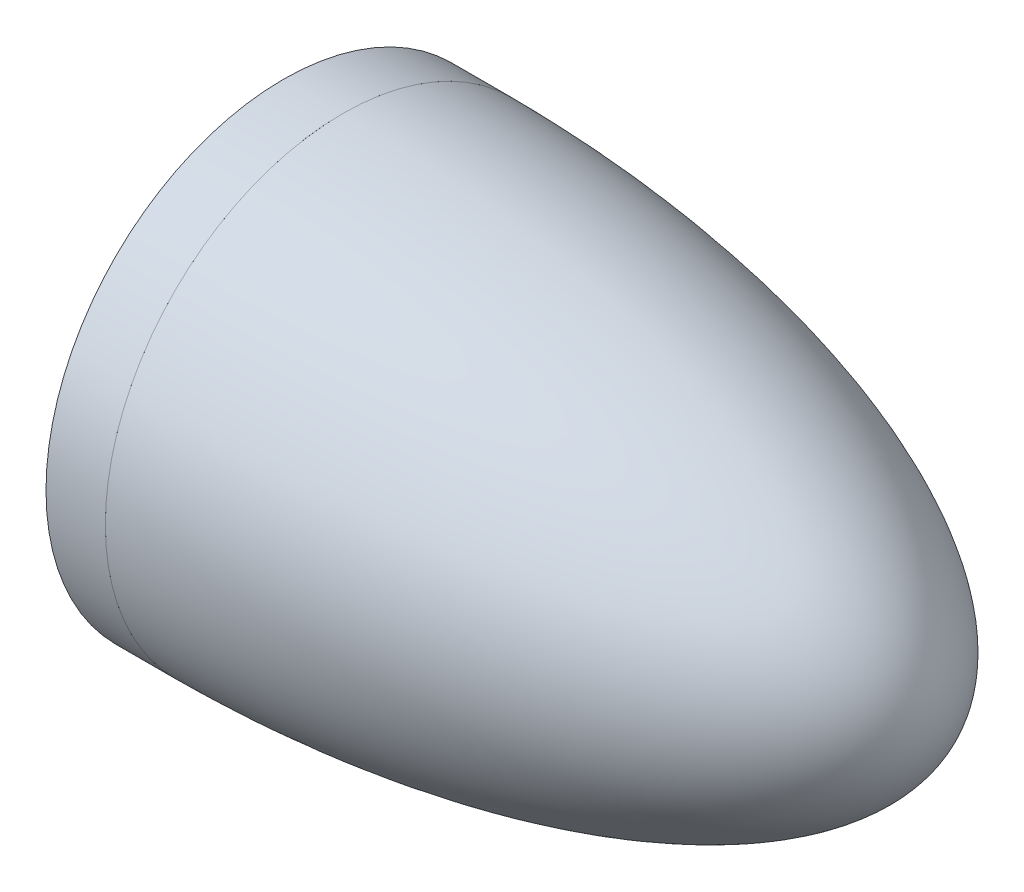
ISO-10303-21;
HEADER;
FILE_DESCRIPTION(('STEP AP214'),'2;1');
FILE_NAME('part.step','',(''),(''),'','','');
FILE_SCHEMA(('AUTOMOTIVE_DESIGN { 1 0 10303 214 1 1 1 1 }'));
ENDSEC;
DATA;
#1=APPLICATION_CONTEXT('core data for automotive mechanical design processes');
#2=APPLICATION_PROTOCOL_DEFINITION('international standard','automotive_design',2000,#1);
#3=PRODUCT_CONTEXT('',#1,'mechanical');
#4=PRODUCT('Part','Part','',(#3));
#5=PRODUCT_RELATED_PRODUCT_CATEGORY('part','',(#4));
#6=PRODUCT_DEFINITION_FORMATION('','',#4);
#7=PRODUCT_DEFINITION_CONTEXT('part definition',#1,'design');
#8=PRODUCT_DEFINITION('design','',#6,#7);
#9=PRODUCT_DEFINITION_SHAPE('','',#8);
#10=(LENGTH_UNIT() NAMED_UNIT(*) SI_UNIT(.MILLI.,.METRE.));
#11=(NAMED_UNIT(*) PLANE_ANGLE_UNIT() SI_UNIT($,.RADIAN.));
#12=(NAMED_UNIT(*) SI_UNIT($,.STERADIAN.) SOLID_ANGLE_UNIT());
#13=UNCERTAINTY_MEASURE_WITH_UNIT(LENGTH_MEASURE(1.E-05),#10,'distance_accuracy_value','');
#14=(GEOMETRIC_REPRESENTATION_CONTEXT(3) GLOBAL_UNCERTAINTY_ASSIGNED_CONTEXT((#13)) GLOBAL_UNIT_ASSIGNED_CONTEXT((#10,
#11,#12)) REPRESENTATION_CONTEXT('',''));
#15=CARTESIAN_POINT('',(0.,0.,0.));
#16=DIRECTION('',(0.,0.,1.));
#17=DIRECTION('',(1.,0.,0.));
#18=AXIS2_PLACEMENT_3D('',#15,#16,#17);
#19=CARTESIAN_POINT('',(-5.,0.,0.));
#20=DIRECTION('',(1.,0.,0.));
#21=DIRECTION('',(0.,0.,-1.));
#22=AXIS2_PLACEMENT_3D('',#19,#20,#21);
#23=CYLINDRICAL_SURFACE('',#22,19.9999999999999);
#24=CARTESIAN_POINT('',(-5.,0.,0.));
#25=DIRECTION('',(1.,0.,0.));
#26=DIRECTION('',(0.,0.,-1.));
#27=AXIS2_PLACEMENT_3D('',#24,#25,#26);
#28=CIRCLE('',#27,19.9999999999999);
#29=CARTESIAN_POINT('',(-5.,0.,-19.9999999999999));
#30=VERTEX_POINT('',#29);
#31=EDGE_CURVE('E44',#30,#30,#28,.T.);
#32=ORIENTED_EDGE('',*,*,#31,.T.);
#33=EDGE_LOOP('',(#32));
#34=FACE_BOUND('',#33,.T.);
#35=CARTESIAN_POINT('',(0.,0.,0.));
#36=DIRECTION('',(1.,0.,0.));
#37=DIRECTION('',(0.,0.,-1.));
#38=AXIS2_PLACEMENT_3D('',#35,#36,#37);
#39=CIRCLE('',#38,19.9999999999999);
#40=CARTESIAN_POINT('',(0.,0.,-19.9999999999999));
#41=VERTEX_POINT('',#40);
#42=EDGE_CURVE('E112',#41,#41,#39,.T.);
#43=ORIENTED_EDGE('',*,*,#42,.F.);
#44=EDGE_LOOP('',(#43));
#45=FACE_BOUND('',#44,.T.);
#46=ADVANCED_FACE('F36',(#34,#45),#23,.T.);
#47=CARTESIAN_POINT('',(-5.,0.,0.));
#48=DIRECTION('',(1.,0.,0.));
#49=DIRECTION('',(0.,0.,-1.));
#50=AXIS2_PLACEMENT_3D('',#47,#48,#49);
#51=PLANE('',#50);
#52=DIRECTION('',(0.,0.,1.));
#53=VECTOR('',#52,1.);
#54=CARTESIAN_POINT('',(-5.,14.9439429454179,-1.34342604802451));
#55=LINE('',#54,#53);
#56=CARTESIAN_POINT('',(-5.,14.9439429454179,-1.34342604802451));
#57=VERTEX_POINT('',#56);
#58=CARTESIAN_POINT('',(-5.,14.9439429454179,1.16657395197549));
#59=VERTEX_POINT('',#58);
#60=EDGE_CURVE('E106',#57,#59,#55,.T.);
#61=ORIENTED_EDGE('',*,*,#60,.F.);
#62=DIRECTION('',(0.,-1.,0.));
#63=VECTOR('',#62,1.);
#64=CARTESIAN_POINT('',(-5.,17.4539429454179,-1.34342604802451));
#65=LINE('',#64,#63);
#66=CARTESIAN_POINT('',(-5.,17.4539429454179,-1.34342604802451));
#67=VERTEX_POINT('',#66);
#68=EDGE_CURVE('E51',#67,#57,#65,.T.);
#69=ORIENTED_EDGE('',*,*,#68,.F.);
#70=DIRECTION('',(0.,0.,-1.));
#71=VECTOR('',#70,1.);
#72=CARTESIAN_POINT('',(-5.,17.4539429454179,-1.34342604802451));
#73=LINE('',#72,#71);
#74=CARTESIAN_POINT('',(-5.,17.4539429454179,1.16657395197549));
#75=VERTEX_POINT('',#74);
#76=EDGE_CURVE('E97',#75,#67,#73,.T.);
#77=ORIENTED_EDGE('',*,*,#76,.F.);
#78=DIRECTION('',(0.,1.,0.));
#79=VECTOR('',#78,1.);
#80=CARTESIAN_POINT('',(-5.,17.4539429454179,1.16657395197549));
#81=LINE('',#80,#79);
#82=EDGE_CURVE('E100',#59,#75,#81,.T.);
#83=ORIENTED_EDGE('',*,*,#82,.F.);
#84=EDGE_LOOP('',(#61,#69,#77,#83));
#85=FACE_BOUND('',#84,.T.);
#86=ORIENTED_EDGE('',*,*,#31,.F.);
#87=EDGE_LOOP('',(#86));
#88=FACE_BOUND('',#87,.T.);
#89=ADVANCED_FACE('F130',(#85,#88),#51,.F.);
#90=CARTESIAN_POINT('',(0.,0.,0.));
#91=DIRECTION('',(1.,0.,0.));
#92=DIRECTION('',(0.,0.,-1.));
#93=AXIS2_PLACEMENT_3D('',#90,#91,#92);
#94=PLANE('',#93);
#95=CARTESIAN_POINT('',(0.,0.,0.));
#96=DIRECTION('',(-1.,0.,0.));
#97=DIRECTION('',(0.,-1.,0.));
#98=AXIS2_PLACEMENT_3D('',#95,#96,#97);
#99=CIRCLE('',#98,19.9995049222106);
#100=CARTESIAN_POINT('',(0.,-19.9995049222106,0.));
#101=VERTEX_POINT('',#100);
#102=EDGE_CURVE('E11',#101,#101,#99,.F.);
#103=ORIENTED_EDGE('',*,*,#102,.F.);
#104=EDGE_LOOP('',(#103));
#105=FACE_BOUND('',#104,.T.);
#106=ORIENTED_EDGE('',*,*,#42,.T.);
#107=EDGE_LOOP('',(#106));
#108=FACE_BOUND('',#107,.T.);
#109=ADVANCED_FACE('F127',(#105,#108),#94,.T.);
#110=CARTESIAN_POINT('',(49.6710386811935,0.,0.));
#111=CARTESIAN_POINT('',(49.6710315503557,0.248502322667477,0.));
#112=CARTESIAN_POINT('',(49.6510475115535,0.731297666648856,0.));
#113=CARTESIAN_POINT('',(49.5632537827606,1.44804584916464,0.));
#114=CARTESIAN_POINT('',(49.3434903892149,2.35581971036833,0.));
#115=CARTESIAN_POINT('',(49.0337727137895,3.23104563032153,0.));
#116=CARTESIAN_POINT('',(48.638593095062,4.08034153990643,0.));
#117=CARTESIAN_POINT('',(48.1340300739625,4.95672454161335,0.));
#118=CARTESIAN_POINT('',(47.4897462856223,5.8773420083607,0.));
#119=CARTESIAN_POINT('',(46.6882672003901,6.8385893720487,0.));
#120=CARTESIAN_POINT('',(45.639838989352,7.90403626433184,0.));
#121=CARTESIAN_POINT('',(44.3756698952104,8.99476771148884,0.));
#122=CARTESIAN_POINT('',(42.9017938131182,10.0821773342827,0.));
#123=CARTESIAN_POINT('',(41.0195059202543,11.2824611546492,0.));
#124=CARTESIAN_POINT('',(38.632307398041,12.5850804303314,0.));
#125=CARTESIAN_POINT('',(36.1584860077577,13.7154343320367,0.));
#126=CARTESIAN_POINT('',(33.6264717866154,14.7047329771932,0.));
#127=CARTESIAN_POINT('',(30.8657977726553,15.6514860784571,0.));
#128=CARTESIAN_POINT('',(28.536388947074,16.3518837687482,0.));
#129=CARTESIAN_POINT('',(26.1848963792984,16.9732787771885,0.));
#130=CARTESIAN_POINT('',(23.8158015842151,17.5225066245917,0.));
#131=CARTESIAN_POINT('',(21.9115574044298,17.9209379737054,0.));
#132=CARTESIAN_POINT('',(19.9995083753593,18.280402064589,0.));
#133=CARTESIAN_POINT('',(18.0809769015327,18.6026009389892,0.));
#134=CARTESIAN_POINT('',(16.1565515835045,18.8889782379766,0.));
#135=CARTESIAN_POINT('',(14.2276852523226,19.1407645574747,0.));
#136=CARTESIAN_POINT('',(12.2941018945324,19.3589972692501,0.));
#137=CARTESIAN_POINT('',(10.358210995853,19.5445464845103,0.));
#138=CARTESIAN_POINT('',(8.66008503737517,19.6789315937539,0.));
#139=CARTESIAN_POINT('',(7.2060071156051,19.7745023315789,0.));
#140=CARTESIAN_POINT('',(5.98895550413079,19.8412080516913,0.));
#141=CARTESIAN_POINT('',(5.02320870587773,19.8868597580358,0.));
#142=CARTESIAN_POINT('',(4.03994682509499,19.9248400971011,0.));
#143=CARTESIAN_POINT('',(3.08802341100089,19.9551834978279,0.));
#144=CARTESIAN_POINT('',(2.07946464961082,19.9779172800492,0.));
#145=CARTESIAN_POINT('',(1.17344145970013,19.9930618362293,0.));
#146=CARTESIAN_POINT('',(0.346683768127993,19.9987385181329,0.));
#147=CARTESIAN_POINT('',(-0.105238787421893,20.,0.));
#148=CARTESIAN_POINT('',(-0.328961318806414,20.,0.));
#149=B_SPLINE_CURVE_WITH_KNOTS('',4,(#110,#111,#112,#113,#114,#115,#116,#117,#118,#119,#120,
#121,#122,#123,#124,#125,#126,#127,#128,#129,#130,#131,#132,#133,#134,#135,#136,#137,#138,#139,
#140,#141,#142,#143,#144,#145,#146,#147,#148),.UNSPECIFIED.,.F.,.F.,(5,1,1,1,1,1,1,1,1,1,1,1,1,
1,1,1,1,1,1,1,1,1,1,1,1,1,1,1,1,1,1,1,1,1,1,5),(0.0799777950044023,0.0958673840942744,
0.110871542332332,0.126047927059345,0.139606089779318,0.155157278234253,0.170710868256021,
0.190652850867733,0.21139188258878,0.235117384231465,0.266226059800924,0.297334914621526,
0.328443706758255,0.377822471354173,0.440040178420641,0.471149063409876,0.502257948399112,
0.564475689026057,0.595584573081646,0.626693457137235,0.657802333737809,0.688911210338383,
0.720020089822341,0.751128969306299,0.782237847882877,0.813346726459454,0.844455604417541,
0.875564482375627,0.891118922300371,0.906673362225116,0.92222780214986,0.937782242074604,
0.953336681555953,0.968891121037302,0.984445560518651,1.),.UNSPECIFIED.);
#150=CARTESIAN_POINT('',(0.,0.,0.));
#151=DIRECTION('',(-1.,0.,0.));
#152=AXIS1_PLACEMENT('',#150,#151);
#153=SURFACE_OF_REVOLUTION('',#149,#152);
#154=ORIENTED_EDGE('',*,*,#102,.T.);
#155=EDGE_LOOP('',(#154));
#156=FACE_BOUND('',#155,.T.);
#157=CARTESIAN_POINT('',(49.6710386811935,0.,0.));
#158=VERTEX_POINT('',#157);
#159=VERTEX_LOOP('',#158);
#160=FACE_BOUND('',#159,.T.);
#161=ADVANCED_FACE('F38',(#156,#160),#153,.T.);
#162=CARTESIAN_POINT('',(-1.,17.4539429454179,-1.34342604802451));
#163=DIRECTION('',(0.,0.,-1.));
#164=DIRECTION('',(0.,1.,0.));
#165=AXIS2_PLACEMENT_3D('',#162,#163,#164);
#166=PLANE('',#165);
#167=ORIENTED_EDGE('',*,*,#68,.T.);
#168=DIRECTION('',(-1.,0.,0.));
#169=VECTOR('',#168,1.);
#170=CARTESIAN_POINT('',(-1.,14.9439429454179,-1.34342604802451));
#171=LINE('',#170,#169);
#172=CARTESIAN_POINT('',(-1.,14.9439429454179,-1.34342604802451));
#173=VERTEX_POINT('',#172);
#174=EDGE_CURVE('E75',#173,#57,#171,.T.);
#175=ORIENTED_EDGE('',*,*,#174,.F.);
#176=DIRECTION('',(0.,-1.,0.));
#177=VECTOR('',#176,1.);
#178=CARTESIAN_POINT('',(-1.,17.4539429454179,-1.34342604802451));
#179=LINE('',#178,#177);
#180=CARTESIAN_POINT('',(-1.,17.4539429454179,-1.34342604802451));
#181=VERTEX_POINT('',#180);
#182=EDGE_CURVE('E79',#181,#173,#179,.T.);
#183=ORIENTED_EDGE('',*,*,#182,.F.);
#184=DIRECTION('',(-1.,0.,0.));
#185=VECTOR('',#184,1.);
#186=CARTESIAN_POINT('',(-1.,17.4539429454179,-1.34342604802451));
#187=LINE('',#186,#185);
#188=EDGE_CURVE('E110',#181,#67,#187,.T.);
#189=ORIENTED_EDGE('',*,*,#188,.T.);
#190=EDGE_LOOP('',(#167,#175,#183,#189));
#191=FACE_BOUND('',#190,.T.);
#192=ADVANCED_FACE('F77',(#191),#166,.F.);
#193=CARTESIAN_POINT('',(-1.,17.4539429454179,-1.34342604802451));
#194=DIRECTION('',(0.,1.,0.));
#195=DIRECTION('',(0.,0.,1.));
#196=AXIS2_PLACEMENT_3D('',#193,#194,#195);
#197=PLANE('',#196);
#198=ORIENTED_EDGE('',*,*,#76,.T.);
#199=ORIENTED_EDGE('',*,*,#188,.F.);
#200=DIRECTION('',(0.,0.,-1.));
#201=VECTOR('',#200,1.);
#202=CARTESIAN_POINT('',(-1.,17.4539429454179,-1.34342604802451));
#203=LINE('',#202,#201);
#204=CARTESIAN_POINT('',(-1.,17.4539429454179,1.16657395197549));
#205=VERTEX_POINT('',#204);
#206=EDGE_CURVE('E85',#205,#181,#203,.T.);
#207=ORIENTED_EDGE('',*,*,#206,.F.);
#208=DIRECTION('',(-1.,0.,0.));
#209=VECTOR('',#208,1.);
#210=CARTESIAN_POINT('',(-1.,17.4539429454179,1.16657395197549));
#211=LINE('',#210,#209);
#212=EDGE_CURVE('E113',#205,#75,#211,.T.);
#213=ORIENTED_EDGE('',*,*,#212,.T.);
#214=EDGE_LOOP('',(#198,#199,#207,#213));
#215=FACE_BOUND('',#214,.T.);
#216=ADVANCED_FACE('F143',(#215),#197,.F.);
#217=CARTESIAN_POINT('',(-1.,17.4539429454179,1.16657395197549));
#218=DIRECTION('',(0.,0.,1.));
#219=DIRECTION('',(1.,0.,0.));
#220=AXIS2_PLACEMENT_3D('',#217,#218,#219);
#221=PLANE('',#220);
#222=ORIENTED_EDGE('',*,*,#82,.T.);
#223=ORIENTED_EDGE('',*,*,#212,.F.);
#224=DIRECTION('',(0.,1.,0.));
#225=VECTOR('',#224,1.);
#226=CARTESIAN_POINT('',(-1.,17.4539429454179,1.16657395197549));
#227=LINE('',#226,#225);
#228=CARTESIAN_POINT('',(-1.,14.9439429454179,1.16657395197549));
#229=VERTEX_POINT('',#228);
#230=EDGE_CURVE('E93',#229,#205,#227,.T.);
#231=ORIENTED_EDGE('',*,*,#230,.F.);
#232=DIRECTION('',(-1.,0.,0.));
#233=VECTOR('',#232,1.);
#234=CARTESIAN_POINT('',(-1.,14.9439429454179,1.16657395197549));
#235=LINE('',#234,#233);
#236=EDGE_CURVE('E84',#229,#59,#235,.T.);
#237=ORIENTED_EDGE('',*,*,#236,.T.);
#238=EDGE_LOOP('',(#222,#223,#231,#237));
#239=FACE_BOUND('',#238,.T.);
#240=ADVANCED_FACE('F146',(#239),#221,.F.);
#241=CARTESIAN_POINT('',(-1.,14.9439429454179,-1.34342604802451));
#242=DIRECTION('',(0.,-1.,0.));
#243=DIRECTION('',(0.,0.,-1.));
#244=AXIS2_PLACEMENT_3D('',#241,#242,#243);
#245=PLANE('',#244);
#246=ORIENTED_EDGE('',*,*,#60,.T.);
#247=ORIENTED_EDGE('',*,*,#236,.F.);
#248=DIRECTION('',(0.,0.,1.));
#249=VECTOR('',#248,1.);
#250=CARTESIAN_POINT('',(-1.,14.9439429454179,-1.34342604802451));
#251=LINE('',#250,#249);
#252=EDGE_CURVE('E88',#173,#229,#251,.T.);
#253=ORIENTED_EDGE('',*,*,#252,.F.);
#254=ORIENTED_EDGE('',*,*,#174,.T.);
#255=EDGE_LOOP('',(#246,#247,#253,#254));
#256=FACE_BOUND('',#255,.T.);
#257=ADVANCED_FACE('F89',(#256),#245,.F.);
#258=CARTESIAN_POINT('',(-1.,0.,0.));
#259=DIRECTION('',(-1.,0.,0.));
#260=DIRECTION('',(0.,0.,1.));
#261=AXIS2_PLACEMENT_3D('',#258,#259,#260);
#262=PLANE('',#261);
#263=ORIENTED_EDGE('',*,*,#182,.T.);
#264=ORIENTED_EDGE('',*,*,#252,.T.);
#265=ORIENTED_EDGE('',*,*,#230,.T.);
#266=ORIENTED_EDGE('',*,*,#206,.T.);
#267=EDGE_LOOP('',(#263,#264,#265,#266));
#268=FACE_BOUND('',#267,.T.);
#269=ADVANCED_FACE('F95',(#268),#262,.T.);
#270=CLOSED_SHELL('',(#46,#89,#109,#161,#192,#216,#240,#257,#269));
#271=MANIFOLD_SOLID_BREP('B2',#270);
#272=ADVANCED_BREP_SHAPE_REPRESENTATION('',(#18,#271),#14);
#273=SHAPE_DEFINITION_REPRESENTATION(#9,#272);
ENDSEC;
END-ISO-10303-21;
